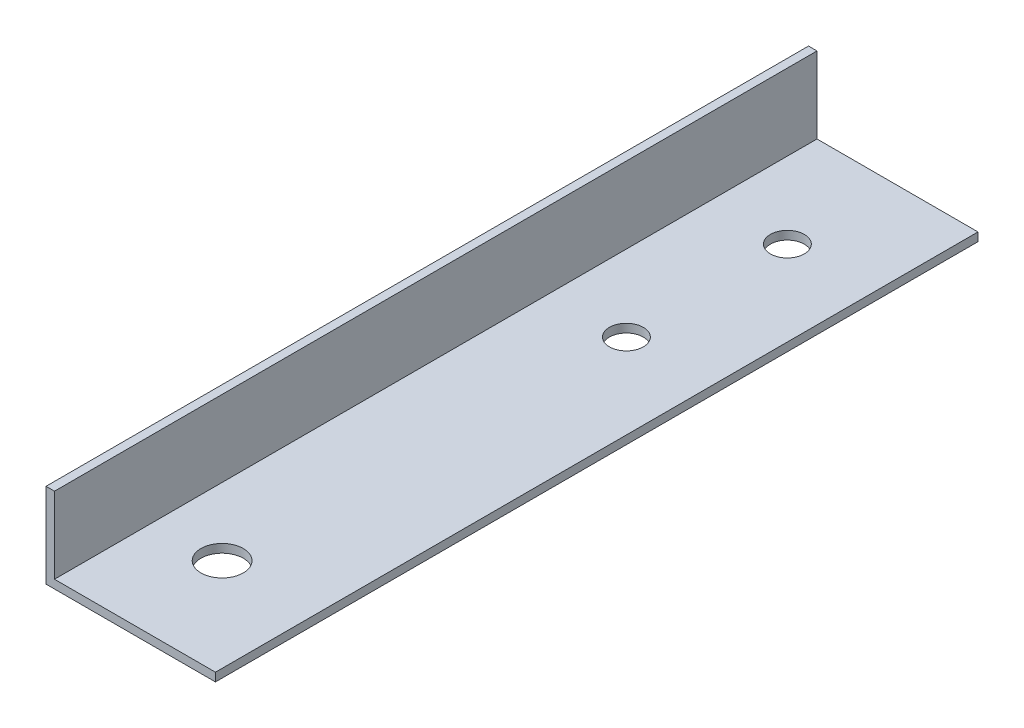
ISO-10303-21;
HEADER;
FILE_DESCRIPTION(('STEP AP214'),'2;1');
FILE_NAME('part.step','',(''),(''),'','','');
FILE_SCHEMA(('AUTOMOTIVE_DESIGN { 1 0 10303 214 1 1 1 1 }'));
ENDSEC;
DATA;
#1=APPLICATION_CONTEXT('core data for automotive mechanical design processes');
#2=APPLICATION_PROTOCOL_DEFINITION('international standard','automotive_design',2000,#1);
#3=PRODUCT_CONTEXT('',#1,'mechanical');
#4=PRODUCT('Part','Part','',(#3));
#5=PRODUCT_RELATED_PRODUCT_CATEGORY('part','',(#4));
#6=PRODUCT_DEFINITION_FORMATION('','',#4);
#7=PRODUCT_DEFINITION_CONTEXT('part definition',#1,'design');
#8=PRODUCT_DEFINITION('design','',#6,#7);
#9=PRODUCT_DEFINITION_SHAPE('','',#8);
#10=(LENGTH_UNIT() NAMED_UNIT(*) SI_UNIT(.MILLI.,.METRE.));
#11=(NAMED_UNIT(*) PLANE_ANGLE_UNIT() SI_UNIT($,.RADIAN.));
#12=(NAMED_UNIT(*) SI_UNIT($,.STERADIAN.) SOLID_ANGLE_UNIT());
#13=UNCERTAINTY_MEASURE_WITH_UNIT(LENGTH_MEASURE(1.E-05),#10,'distance_accuracy_value','');
#14=(GEOMETRIC_REPRESENTATION_CONTEXT(3) GLOBAL_UNCERTAINTY_ASSIGNED_CONTEXT((#13)) GLOBAL_UNIT_ASSIGNED_CONTEXT((#10,
#11,#12)) REPRESENTATION_CONTEXT('',''));
#15=CARTESIAN_POINT('',(0.,0.,0.));
#16=DIRECTION('',(0.,0.,1.));
#17=DIRECTION('',(1.,0.,0.));
#18=AXIS2_PLACEMENT_3D('',#15,#16,#17);
#19=CARTESIAN_POINT('',(-69.5798319327731,11.327731092437,180.));
#20=DIRECTION('',(1.,0.,0.));
#21=DIRECTION('',(0.,0.,-1.));
#22=AXIS2_PLACEMENT_3D('',#19,#20,#21);
#23=PLANE('',#22);
#24=DIRECTION('',(0.,-1.,0.));
#25=VECTOR('',#24,1.);
#26=CARTESIAN_POINT('',(-69.5798319327731,11.327731092437,0.));
#27=LINE('',#26,#25);
#28=CARTESIAN_POINT('',(-69.5798319327731,29.327731092437,0.));
#29=VERTEX_POINT('',#28);
#30=CARTESIAN_POINT('',(-69.5798319327731,9.32773109243698,0.));
#31=VERTEX_POINT('',#30);
#32=EDGE_CURVE('E83',#29,#31,#27,.T.);
#33=ORIENTED_EDGE('',*,*,#32,.T.);
#34=DIRECTION('',(0.,0.,-1.));
#35=VECTOR('',#34,1.);
#36=CARTESIAN_POINT('',(-69.5798319327731,9.32773109243698,180.));
#37=LINE('',#36,#35);
#38=CARTESIAN_POINT('',(-69.5798319327731,9.32773109243698,180.));
#39=VERTEX_POINT('',#38);
#40=EDGE_CURVE('E11',#39,#31,#37,.T.);
#41=ORIENTED_EDGE('',*,*,#40,.F.);
#42=DIRECTION('',(0.,-1.,0.));
#43=VECTOR('',#42,1.);
#44=CARTESIAN_POINT('',(-69.5798319327731,29.327731092437,180.));
#45=LINE('',#44,#43);
#46=CARTESIAN_POINT('',(-69.5798319327731,29.327731092437,180.));
#47=VERTEX_POINT('',#46);
#48=EDGE_CURVE('E89',#47,#39,#45,.T.);
#49=ORIENTED_EDGE('',*,*,#48,.F.);
#50=DIRECTION('',(0.,0.,-1.));
#51=VECTOR('',#50,1.);
#52=CARTESIAN_POINT('',(-69.5798319327731,29.327731092437,180.));
#53=LINE('',#52,#51);
#54=EDGE_CURVE('E117',#47,#29,#53,.T.);
#55=ORIENTED_EDGE('',*,*,#54,.T.);
#56=EDGE_LOOP('',(#33,#41,#49,#55));
#57=FACE_BOUND('',#56,.T.);
#58=ADVANCED_FACE('F35',(#57),#23,.F.);
#59=CARTESIAN_POINT('',(-69.5798319327731,9.32773109243698,180.));
#60=DIRECTION('',(0.,1.,0.));
#61=DIRECTION('',(0.,0.,1.));
#62=AXIS2_PLACEMENT_3D('',#59,#60,#61);
#63=PLANE('',#62);
#64=CARTESIAN_POINT('',(-51.579831932773,9.32773109243698,156.425945109534));
#65=DIRECTION('',(0.,-1.,0.));
#66=DIRECTION('',(0.,0.,-1.));
#67=AXIS2_PLACEMENT_3D('',#64,#65,#66);
#68=CIRCLE('',#67,5.);
#69=CARTESIAN_POINT('',(-51.579831932773,9.32773109243698,151.425945109534));
#70=VERTEX_POINT('',#69);
#71=EDGE_CURVE('E182',#70,#70,#68,.T.);
#72=ORIENTED_EDGE('',*,*,#71,.F.);
#73=EDGE_LOOP('',(#72));
#74=FACE_BOUND('',#73,.T.);
#75=CARTESIAN_POINT('',(-49.579831932773,9.32773109243698,25.));
#76=DIRECTION('',(0.,-1.,0.));
#77=DIRECTION('',(0.,0.,-1.));
#78=AXIS2_PLACEMENT_3D('',#75,#76,#77);
#79=CIRCLE('',#78,4.00000000000001);
#80=CARTESIAN_POINT('',(-49.579831932773,9.32773109243698,21.));
#81=VERTEX_POINT('',#80);
#82=EDGE_CURVE('E181',#81,#81,#79,.T.);
#83=ORIENTED_EDGE('',*,*,#82,.F.);
#84=EDGE_LOOP('',(#83));
#85=FACE_BOUND('',#84,.T.);
#86=CARTESIAN_POINT('',(-49.579831932773,9.32773109243698,63.0000000000001));
#87=DIRECTION('',(0.,-1.,0.));
#88=DIRECTION('',(0.,0.,-1.));
#89=AXIS2_PLACEMENT_3D('',#86,#87,#88);
#90=CIRCLE('',#89,4.00000000000001);
#91=CARTESIAN_POINT('',(-49.579831932773,9.32773109243698,59.));
#92=VERTEX_POINT('',#91);
#93=EDGE_CURVE('E139',#92,#92,#90,.T.);
#94=ORIENTED_EDGE('',*,*,#93,.F.);
#95=EDGE_LOOP('',(#94));
#96=FACE_BOUND('',#95,.T.);
#97=DIRECTION('',(1.,0.,0.));
#98=VECTOR('',#97,1.);
#99=CARTESIAN_POINT('',(-69.5798319327731,9.32773109243698,0.));
#100=LINE('',#99,#98);
#101=CARTESIAN_POINT('',(-29.5798319327731,9.32773109243698,0.));
#102=VERTEX_POINT('',#101);
#103=EDGE_CURVE('E122',#31,#102,#100,.T.);
#104=ORIENTED_EDGE('',*,*,#103,.T.);
#105=DIRECTION('',(0.,0.,-1.));
#106=VECTOR('',#105,1.);
#107=CARTESIAN_POINT('',(-29.5798319327731,9.32773109243698,180.));
#108=LINE('',#107,#106);
#109=CARTESIAN_POINT('',(-29.5798319327731,9.32773109243698,180.));
#110=VERTEX_POINT('',#109);
#111=EDGE_CURVE('E44',#110,#102,#108,.T.);
#112=ORIENTED_EDGE('',*,*,#111,.F.);
#113=DIRECTION('',(1.,0.,0.));
#114=VECTOR('',#113,1.);
#115=CARTESIAN_POINT('',(-69.5798319327731,9.32773109243698,180.));
#116=LINE('',#115,#114);
#117=EDGE_CURVE('E172',#39,#110,#116,.T.);
#118=ORIENTED_EDGE('',*,*,#117,.F.);
#119=ORIENTED_EDGE('',*,*,#40,.T.);
#120=EDGE_LOOP('',(#104,#112,#118,#119));
#121=FACE_BOUND('',#120,.T.);
#122=ADVANCED_FACE('F161',(#74,#85,#96,#121),#63,.F.);
#123=CARTESIAN_POINT('',(-29.5798319327731,11.327731092437,180.));
#124=DIRECTION('',(-1.,0.,0.));
#125=DIRECTION('',(0.,-1.,0.));
#126=AXIS2_PLACEMENT_3D('',#123,#124,#125);
#127=PLANE('',#126);
#128=DIRECTION('',(0.,1.,0.));
#129=VECTOR('',#128,1.);
#130=CARTESIAN_POINT('',(-29.5798319327731,11.327731092437,0.));
#131=LINE('',#130,#129);
#132=CARTESIAN_POINT('',(-29.5798319327731,11.327731092437,0.));
#133=VERTEX_POINT('',#132);
#134=EDGE_CURVE('E124',#102,#133,#131,.T.);
#135=ORIENTED_EDGE('',*,*,#134,.T.);
#136=DIRECTION('',(0.,0.,-1.));
#137=VECTOR('',#136,1.);
#138=CARTESIAN_POINT('',(-29.5798319327731,11.327731092437,180.));
#139=LINE('',#138,#137);
#140=CARTESIAN_POINT('',(-29.5798319327731,11.327731092437,180.));
#141=VERTEX_POINT('',#140);
#142=EDGE_CURVE('E112',#141,#133,#139,.T.);
#143=ORIENTED_EDGE('',*,*,#142,.F.);
#144=DIRECTION('',(0.,1.,0.));
#145=VECTOR('',#144,1.);
#146=CARTESIAN_POINT('',(-29.5798319327731,11.327731092437,180.));
#147=LINE('',#146,#145);
#148=EDGE_CURVE('E103',#110,#141,#147,.T.);
#149=ORIENTED_EDGE('',*,*,#148,.F.);
#150=ORIENTED_EDGE('',*,*,#111,.T.);
#151=EDGE_LOOP('',(#135,#143,#149,#150));
#152=FACE_BOUND('',#151,.T.);
#153=ADVANCED_FACE('F167',(#152),#127,.F.);
#154=CARTESIAN_POINT('',(-67.5798319327731,11.327731092437,180.));
#155=DIRECTION('',(0.,-1.,0.));
#156=DIRECTION('',(0.,0.,-1.));
#157=AXIS2_PLACEMENT_3D('',#154,#155,#156);
#158=PLANE('',#157);
#159=CARTESIAN_POINT('',(-51.579831932773,11.327731092437,156.425945109534));
#160=DIRECTION('',(0.,-1.,0.));
#161=DIRECTION('',(0.,0.,-1.));
#162=AXIS2_PLACEMENT_3D('',#159,#160,#161);
#163=CIRCLE('',#162,5.);
#164=CARTESIAN_POINT('',(-51.579831932773,11.327731092437,151.425945109534));
#165=VERTEX_POINT('',#164);
#166=EDGE_CURVE('E38',#165,#165,#163,.T.);
#167=ORIENTED_EDGE('',*,*,#166,.T.);
#168=EDGE_LOOP('',(#167));
#169=FACE_BOUND('',#168,.T.);
#170=CARTESIAN_POINT('',(-49.579831932773,11.327731092437,25.));
#171=DIRECTION('',(0.,-1.,0.));
#172=DIRECTION('',(0.,0.,-1.));
#173=AXIS2_PLACEMENT_3D('',#170,#171,#172);
#174=CIRCLE('',#173,4.00000000000001);
#175=CARTESIAN_POINT('',(-49.579831932773,11.327731092437,21.));
#176=VERTEX_POINT('',#175);
#177=EDGE_CURVE('E138',#176,#176,#174,.T.);
#178=ORIENTED_EDGE('',*,*,#177,.T.);
#179=EDGE_LOOP('',(#178));
#180=FACE_BOUND('',#179,.T.);
#181=CARTESIAN_POINT('',(-49.579831932773,11.327731092437,63.0000000000001));
#182=DIRECTION('',(0.,-1.,0.));
#183=DIRECTION('',(0.,0.,-1.));
#184=AXIS2_PLACEMENT_3D('',#181,#182,#183);
#185=CIRCLE('',#184,4.00000000000001);
#186=CARTESIAN_POINT('',(-49.579831932773,11.327731092437,59.));
#187=VERTEX_POINT('',#186);
#188=EDGE_CURVE('E136',#187,#187,#185,.T.);
#189=ORIENTED_EDGE('',*,*,#188,.T.);
#190=EDGE_LOOP('',(#189));
#191=FACE_BOUND('',#190,.T.);
#192=DIRECTION('',(-1.,0.,0.));
#193=VECTOR('',#192,1.);
#194=CARTESIAN_POINT('',(-67.5798319327731,11.327731092437,0.));
#195=LINE('',#194,#193);
#196=CARTESIAN_POINT('',(-67.5798319327731,11.327731092437,0.));
#197=VERTEX_POINT('',#196);
#198=EDGE_CURVE('E111',#133,#197,#195,.T.);
#199=ORIENTED_EDGE('',*,*,#198,.T.);
#200=DIRECTION('',(0.,0.,-1.));
#201=VECTOR('',#200,1.);
#202=CARTESIAN_POINT('',(-67.5798319327731,11.327731092437,180.));
#203=LINE('',#202,#201);
#204=CARTESIAN_POINT('',(-67.5798319327731,11.327731092437,180.));
#205=VERTEX_POINT('',#204);
#206=EDGE_CURVE('E108',#205,#197,#203,.T.);
#207=ORIENTED_EDGE('',*,*,#206,.F.);
#208=DIRECTION('',(-1.,0.,0.));
#209=VECTOR('',#208,1.);
#210=CARTESIAN_POINT('',(-67.5798319327731,11.327731092437,180.));
#211=LINE('',#210,#209);
#212=EDGE_CURVE('E97',#141,#205,#211,.T.);
#213=ORIENTED_EDGE('',*,*,#212,.F.);
#214=ORIENTED_EDGE('',*,*,#142,.T.);
#215=EDGE_LOOP('',(#199,#207,#213,#214));
#216=FACE_BOUND('',#215,.T.);
#217=ADVANCED_FACE('F109',(#169,#180,#191,#216),#158,.F.);
#218=CARTESIAN_POINT('',(-67.5798319327731,29.327731092437,180.));
#219=DIRECTION('',(-1.,0.,0.));
#220=DIRECTION('',(0.,0.,1.));
#221=AXIS2_PLACEMENT_3D('',#218,#219,#220);
#222=PLANE('',#221);
#223=DIRECTION('',(0.,1.,0.));
#224=VECTOR('',#223,1.);
#225=CARTESIAN_POINT('',(-67.5798319327731,29.327731092437,0.));
#226=LINE('',#225,#224);
#227=CARTESIAN_POINT('',(-67.5798319327731,29.327731092437,0.));
#228=VERTEX_POINT('',#227);
#229=EDGE_CURVE('E76',#197,#228,#226,.T.);
#230=ORIENTED_EDGE('',*,*,#229,.T.);
#231=DIRECTION('',(0.,0.,-1.));
#232=VECTOR('',#231,1.);
#233=CARTESIAN_POINT('',(-67.5798319327731,29.327731092437,180.));
#234=LINE('',#233,#232);
#235=CARTESIAN_POINT('',(-67.5798319327731,29.327731092437,180.));
#236=VERTEX_POINT('',#235);
#237=EDGE_CURVE('E113',#236,#228,#234,.T.);
#238=ORIENTED_EDGE('',*,*,#237,.F.);
#239=DIRECTION('',(0.,1.,0.));
#240=VECTOR('',#239,1.);
#241=CARTESIAN_POINT('',(-67.5798319327731,29.327731092437,180.));
#242=LINE('',#241,#240);
#243=EDGE_CURVE('E101',#205,#236,#242,.T.);
#244=ORIENTED_EDGE('',*,*,#243,.F.);
#245=ORIENTED_EDGE('',*,*,#206,.T.);
#246=EDGE_LOOP('',(#230,#238,#244,#245));
#247=FACE_BOUND('',#246,.T.);
#248=ADVANCED_FACE('F115',(#247),#222,.F.);
#249=CARTESIAN_POINT('',(-69.5798319327731,29.327731092437,180.));
#250=DIRECTION('',(0.,-1.,0.));
#251=DIRECTION('',(0.,0.,-1.));
#252=AXIS2_PLACEMENT_3D('',#249,#250,#251);
#253=PLANE('',#252);
#254=DIRECTION('',(-1.,0.,0.));
#255=VECTOR('',#254,1.);
#256=CARTESIAN_POINT('',(-69.5798319327731,29.327731092437,0.));
#257=LINE('',#256,#255);
#258=EDGE_CURVE('E128',#228,#29,#257,.T.);
#259=ORIENTED_EDGE('',*,*,#258,.T.);
#260=ORIENTED_EDGE('',*,*,#54,.F.);
#261=DIRECTION('',(-1.,0.,0.));
#262=VECTOR('',#261,1.);
#263=CARTESIAN_POINT('',(-69.5798319327731,29.327731092437,180.));
#264=LINE('',#263,#262);
#265=EDGE_CURVE('E53',#236,#47,#264,.T.);
#266=ORIENTED_EDGE('',*,*,#265,.F.);
#267=ORIENTED_EDGE('',*,*,#237,.T.);
#268=EDGE_LOOP('',(#259,#260,#266,#267));
#269=FACE_BOUND('',#268,.T.);
#270=ADVANCED_FACE('F201',(#269),#253,.F.);
#271=CARTESIAN_POINT('',(0.,0.,180.));
#272=DIRECTION('',(0.,0.,1.));
#273=DIRECTION('',(1.,0.,0.));
#274=AXIS2_PLACEMENT_3D('',#271,#272,#273);
#275=PLANE('',#274);
#276=ORIENTED_EDGE('',*,*,#48,.T.);
#277=ORIENTED_EDGE('',*,*,#117,.T.);
#278=ORIENTED_EDGE('',*,*,#148,.T.);
#279=ORIENTED_EDGE('',*,*,#212,.T.);
#280=ORIENTED_EDGE('',*,*,#243,.T.);
#281=ORIENTED_EDGE('',*,*,#265,.T.);
#282=EDGE_LOOP('',(#276,#277,#278,#279,#280,#281));
#283=FACE_BOUND('',#282,.T.);
#284=ADVANCED_FACE('F99',(#283),#275,.T.);
#285=CARTESIAN_POINT('',(0.,0.,0.));
#286=DIRECTION('',(0.,0.,1.));
#287=DIRECTION('',(1.,0.,0.));
#288=AXIS2_PLACEMENT_3D('',#285,#286,#287);
#289=PLANE('',#288);
#290=ORIENTED_EDGE('',*,*,#32,.F.);
#291=ORIENTED_EDGE('',*,*,#258,.F.);
#292=ORIENTED_EDGE('',*,*,#229,.F.);
#293=ORIENTED_EDGE('',*,*,#198,.F.);
#294=ORIENTED_EDGE('',*,*,#134,.F.);
#295=ORIENTED_EDGE('',*,*,#103,.F.);
#296=EDGE_LOOP('',(#290,#291,#292,#293,#294,#295));
#297=FACE_BOUND('',#296,.T.);
#298=ADVANCED_FACE('F174',(#297),#289,.F.);
#299=CARTESIAN_POINT('',(-49.579831932773,19.327731092437,63.0000000000001));
#300=DIRECTION('',(0.,-1.,0.));
#301=DIRECTION('',(0.,0.,-1.));
#302=AXIS2_PLACEMENT_3D('',#299,#300,#301);
#303=CYLINDRICAL_SURFACE('',#302,4.00000000000001);
#304=ORIENTED_EDGE('',*,*,#93,.T.);
#305=EDGE_LOOP('',(#304));
#306=FACE_BOUND('',#305,.T.);
#307=ORIENTED_EDGE('',*,*,#188,.F.);
#308=EDGE_LOOP('',(#307));
#309=FACE_BOUND('',#308,.T.);
#310=ADVANCED_FACE('F155',(#306,#309),#303,.F.);
#311=CARTESIAN_POINT('',(-49.579831932773,19.327731092437,25.));
#312=DIRECTION('',(0.,-1.,0.));
#313=DIRECTION('',(0.,0.,-1.));
#314=AXIS2_PLACEMENT_3D('',#311,#312,#313);
#315=CYLINDRICAL_SURFACE('',#314,4.00000000000001);
#316=ORIENTED_EDGE('',*,*,#82,.T.);
#317=EDGE_LOOP('',(#316));
#318=FACE_BOUND('',#317,.T.);
#319=ORIENTED_EDGE('',*,*,#177,.F.);
#320=EDGE_LOOP('',(#319));
#321=FACE_BOUND('',#320,.T.);
#322=ADVANCED_FACE('F149',(#318,#321),#315,.F.);
#323=CARTESIAN_POINT('',(-51.579831932773,19.327731092437,156.425945109534));
#324=DIRECTION('',(0.,-1.,0.));
#325=DIRECTION('',(0.,0.,-1.));
#326=AXIS2_PLACEMENT_3D('',#323,#324,#325);
#327=CYLINDRICAL_SURFACE('',#326,5.);
#328=ORIENTED_EDGE('',*,*,#71,.T.);
#329=EDGE_LOOP('',(#328));
#330=FACE_BOUND('',#329,.T.);
#331=ORIENTED_EDGE('',*,*,#166,.F.);
#332=EDGE_LOOP('',(#331));
#333=FACE_BOUND('',#332,.T.);
#334=ADVANCED_FACE('F147',(#330,#333),#327,.F.);
#335=CLOSED_SHELL('',(#58,#122,#153,#217,#248,#270,#284,#298,#310,#322,#334));
#336=MANIFOLD_SOLID_BREP('B2',#335);
#337=ADVANCED_BREP_SHAPE_REPRESENTATION('',(#18,#336),#14);
#338=SHAPE_DEFINITION_REPRESENTATION(#9,#337);
ENDSEC;
END-ISO-10303-21;
